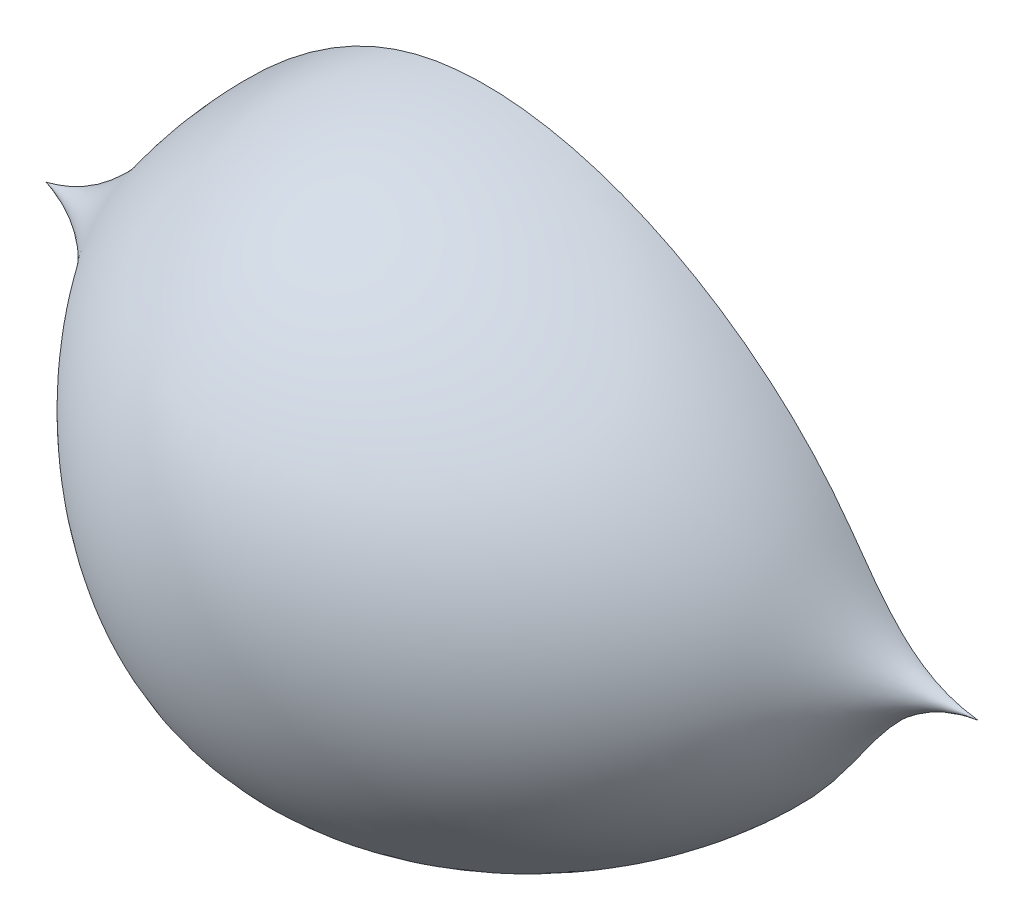
ISO-10303-21;
HEADER;
FILE_DESCRIPTION(('STEP AP214'),'2;1');
FILE_NAME('part.step','',(''),(''),'','','');
FILE_SCHEMA(('AUTOMOTIVE_DESIGN { 1 0 10303 214 1 1 1 1 }'));
ENDSEC;
DATA;
#1=APPLICATION_CONTEXT('core data for automotive mechanical design processes');
#2=APPLICATION_PROTOCOL_DEFINITION('international standard','automotive_design',2000,#1);
#3=PRODUCT_CONTEXT('',#1,'mechanical');
#4=PRODUCT('Part','Part','',(#3));
#5=PRODUCT_RELATED_PRODUCT_CATEGORY('part','',(#4));
#6=PRODUCT_DEFINITION_FORMATION('','',#4);
#7=PRODUCT_DEFINITION_CONTEXT('part definition',#1,'design');
#8=PRODUCT_DEFINITION('design','',#6,#7);
#9=PRODUCT_DEFINITION_SHAPE('','',#8);
#10=(LENGTH_UNIT() NAMED_UNIT(*) SI_UNIT(.MILLI.,.METRE.));
#11=(NAMED_UNIT(*) PLANE_ANGLE_UNIT() SI_UNIT($,.RADIAN.));
#12=(NAMED_UNIT(*) SI_UNIT($,.STERADIAN.) SOLID_ANGLE_UNIT());
#13=UNCERTAINTY_MEASURE_WITH_UNIT(LENGTH_MEASURE(1.E-05),#10,'distance_accuracy_value','');
#14=(GEOMETRIC_REPRESENTATION_CONTEXT(3) GLOBAL_UNCERTAINTY_ASSIGNED_CONTEXT((#13)) GLOBAL_UNIT_ASSIGNED_CONTEXT((#10,
#11,#12)) REPRESENTATION_CONTEXT('',''));
#15=CARTESIAN_POINT('',(0.,0.,0.));
#16=DIRECTION('',(0.,0.,1.));
#17=DIRECTION('',(1.,0.,0.));
#18=AXIS2_PLACEMENT_3D('',#15,#16,#17);
#19=CARTESIAN_POINT('',(-204.433639485933,-72.4652674422328,0.));
#20=CARTESIAN_POINT('',(-240.980324753068,-76.7847835982123,0.));
#21=CARTESIAN_POINT('',(-287.429212036251,-178.888264504383,-7.43147816532512E-13));
#22=CARTESIAN_POINT('',(-472.23575341335,-266.423038833215,-1.35439987867043E-12));
#23=CARTESIAN_POINT('',(-596.022054302135,-148.732100420123,-5.32568448229939E-13));
#24=CARTESIAN_POINT('',(-638.799908049014,-81.3071196582217,0.));
#25=CARTESIAN_POINT('',(-672.678665165431,-72.4652674422327,0.));
#26=B_SPLINE_CURVE_WITH_KNOTS('',3,(#19,#20,#21,#22,#23,#24,#25),.UNSPECIFIED.,.F.,.F.,(4,1,1,1,
4),(0.,0.170037528812394,0.580288365218982,0.826514305217587,1.),.UNSPECIFIED.);
#27=CARTESIAN_POINT('',(-672.678665165431,-72.4652674422327,0.));
#28=DIRECTION('',(-1.,0.,0.));
#29=AXIS1_PLACEMENT('',#27,#28);
#30=SURFACE_OF_REVOLUTION('',#26,#29);
#31=CARTESIAN_POINT('',(-204.433639485933,-72.4652674422327,0.));
#32=CARTESIAN_POINT('',(-240.980324753068,-68.1457512862532,0.));
#33=CARTESIAN_POINT('',(-287.429212036251,33.9577296199177,0.));
#34=CARTESIAN_POINT('',(-472.23575341335,121.492503948749,0.));
#35=CARTESIAN_POINT('',(-596.022054302135,3.80156553565738,0.));
#36=CARTESIAN_POINT('',(-638.799908049014,-63.6234152262438,0.));
#37=CARTESIAN_POINT('',(-672.678665165431,-72.4652674422327,0.));
#38=B_SPLINE_CURVE_WITH_KNOTS('',3,(#31,#32,#33,#34,#35,#36,#37),.UNSPECIFIED.,.F.,.F.,(4,1,1,1,
4),(0.,0.170037528812394,0.580288365218982,0.826514305217587,1.),.UNSPECIFIED.);
#39=CARTESIAN_POINT('',(-204.433639485933,-72.4652674422327,0.));
#40=VERTEX_POINT('',#39);
#41=CARTESIAN_POINT('',(-672.678665165431,-72.4652674422327,0.));
#42=VERTEX_POINT('',#41);
#43=EDGE_CURVE('E43',#40,#42,#38,.T.);
#44=ORIENTED_EDGE('',*,*,#43,.T.);
#45=EDGE_CURVE('E11',#40,#42,#26,.T.);
#46=ORIENTED_EDGE('',*,*,#45,.F.);
#47=EDGE_LOOP('',(#44,#46));
#48=FACE_BOUND('',#47,.T.);
#49=ADVANCED_FACE('F33',(#48),#30,.T.);
#50=CARTESIAN_POINT('',(-445.435557402923,-225.090443015801,-1.06577590470554E-12));
#51=DIRECTION('',(0.,0.,1.));
#52=DIRECTION('',(-1.,0.,0.));
#53=AXIS2_PLACEMENT_3D('',#50,#51,#52);
#54=PLANE('',#53);
#55=ORIENTED_EDGE('',*,*,#45,.T.);
#56=ORIENTED_EDGE('',*,*,#43,.F.);
#57=EDGE_LOOP('',(#55,#56));
#58=FACE_BOUND('',#57,.T.);
#59=ADVANCED_FACE('F50',(#58),#54,.F.);
#60=CLOSED_SHELL('',(#49,#59));
#61=MANIFOLD_SOLID_BREP('B2',#60);
#62=ADVANCED_BREP_SHAPE_REPRESENTATION('',(#18,#61),#14);
#63=SHAPE_DEFINITION_REPRESENTATION(#9,#62);
ENDSEC;
END-ISO-10303-21;
